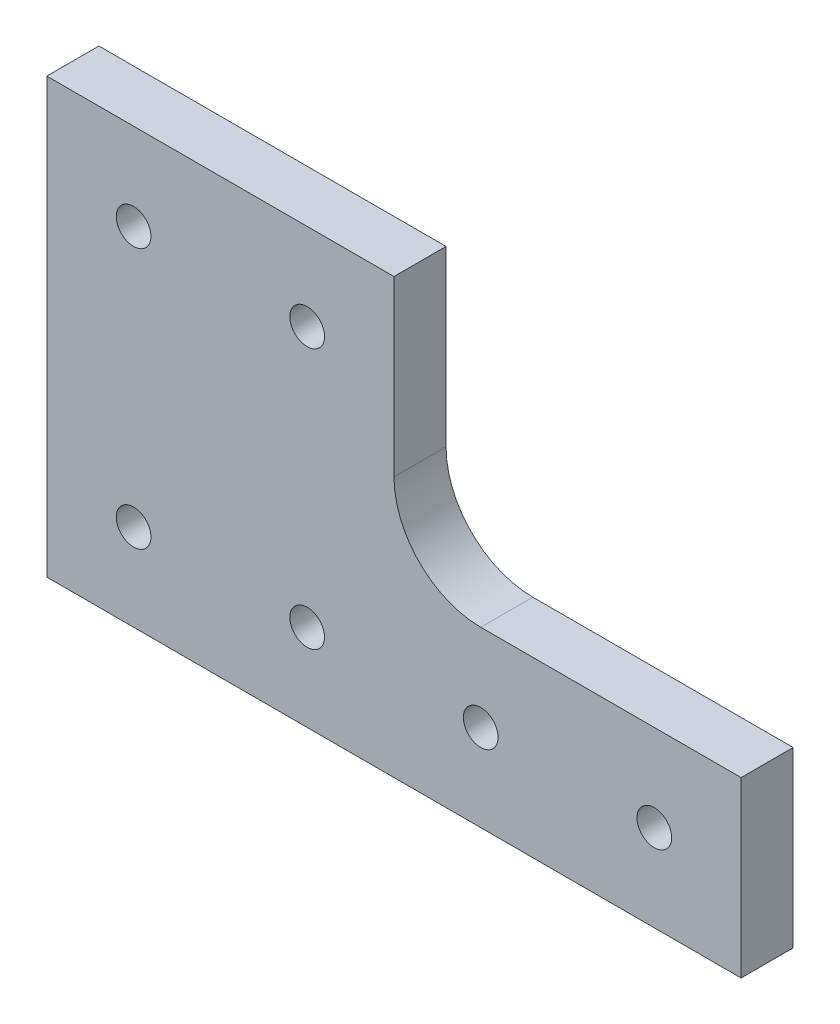
ISO-10303-21;
HEADER;
FILE_DESCRIPTION(('STEP AP214'),'2;1');
FILE_NAME('part.step','',(''),(''),'','','');
FILE_SCHEMA(('AUTOMOTIVE_DESIGN { 1 0 10303 214 1 1 1 1 }'));
ENDSEC;
DATA;
#1=APPLICATION_CONTEXT('core data for automotive mechanical design processes');
#2=APPLICATION_PROTOCOL_DEFINITION('international standard','automotive_design',2000,#1);
#3=PRODUCT_CONTEXT('',#1,'mechanical');
#4=PRODUCT('Part','Part','',(#3));
#5=PRODUCT_RELATED_PRODUCT_CATEGORY('part','',(#4));
#6=PRODUCT_DEFINITION_FORMATION('','',#4);
#7=PRODUCT_DEFINITION_CONTEXT('part definition',#1,'design');
#8=PRODUCT_DEFINITION('design','',#6,#7);
#9=PRODUCT_DEFINITION_SHAPE('','',#8);
#10=(LENGTH_UNIT() NAMED_UNIT(*) SI_UNIT(.MILLI.,.METRE.));
#11=(NAMED_UNIT(*) PLANE_ANGLE_UNIT() SI_UNIT($,.RADIAN.));
#12=(NAMED_UNIT(*) SI_UNIT($,.STERADIAN.) SOLID_ANGLE_UNIT());
#13=UNCERTAINTY_MEASURE_WITH_UNIT(LENGTH_MEASURE(1.E-05),#10,'distance_accuracy_value','');
#14=(GEOMETRIC_REPRESENTATION_CONTEXT(3) GLOBAL_UNCERTAINTY_ASSIGNED_CONTEXT((#13)) GLOBAL_UNIT_ASSIGNED_CONTEXT((#10,
#11,#12)) REPRESENTATION_CONTEXT('',''));
#15=CARTESIAN_POINT('',(0.,0.,0.));
#16=DIRECTION('',(0.,0.,1.));
#17=DIRECTION('',(1.,0.,0.));
#18=AXIS2_PLACEMENT_3D('',#15,#16,#17);
#19=CARTESIAN_POINT('',(0.,0.,6.));
#20=DIRECTION('',(0.,1.,0.));
#21=DIRECTION('',(0.,0.,1.));
#22=AXIS2_PLACEMENT_3D('',#19,#20,#21);
#23=PLANE('',#22);
#24=DIRECTION('',(1.,0.,0.));
#25=VECTOR('',#24,1.);
#26=CARTESIAN_POINT('',(0.,0.,0.));
#27=LINE('',#26,#25);
#28=CARTESIAN_POINT('',(0.,0.,0.));
#29=VERTEX_POINT('',#28);
#30=CARTESIAN_POINT('',(80.,0.,0.));
#31=VERTEX_POINT('',#30);
#32=EDGE_CURVE('E117',#29,#31,#27,.T.);
#33=ORIENTED_EDGE('',*,*,#32,.T.);
#34=DIRECTION('',(0.,0.,-1.));
#35=VECTOR('',#34,1.);
#36=CARTESIAN_POINT('',(80.,0.,6.));
#37=LINE('',#36,#35);
#38=CARTESIAN_POINT('',(80.,0.,6.));
#39=VERTEX_POINT('',#38);
#40=EDGE_CURVE('E98',#39,#31,#37,.T.);
#41=ORIENTED_EDGE('',*,*,#40,.F.);
#42=DIRECTION('',(1.,0.,0.));
#43=VECTOR('',#42,1.);
#44=CARTESIAN_POINT('',(0.,0.,6.));
#45=LINE('',#44,#43);
#46=CARTESIAN_POINT('',(0.,0.,6.));
#47=VERTEX_POINT('',#46);
#48=EDGE_CURVE('E104',#47,#39,#45,.T.);
#49=ORIENTED_EDGE('',*,*,#48,.F.);
#50=DIRECTION('',(0.,0.,-1.));
#51=VECTOR('',#50,1.);
#52=CARTESIAN_POINT('',(0.,0.,6.));
#53=LINE('',#52,#51);
#54=EDGE_CURVE('E130',#47,#29,#53,.T.);
#55=ORIENTED_EDGE('',*,*,#54,.T.);
#56=EDGE_LOOP('',(#33,#41,#49,#55));
#57=FACE_BOUND('',#56,.T.);
#58=ADVANCED_FACE('F35',(#57),#23,.F.);
#59=CARTESIAN_POINT('',(80.,0.,6.));
#60=DIRECTION('',(-1.,0.,0.));
#61=DIRECTION('',(0.,0.,1.));
#62=AXIS2_PLACEMENT_3D('',#59,#60,#61);
#63=PLANE('',#62);
#64=DIRECTION('',(0.,1.,0.));
#65=VECTOR('',#64,1.);
#66=CARTESIAN_POINT('',(80.,0.,0.));
#67=LINE('',#66,#65);
#68=CARTESIAN_POINT('',(80.,20.,0.));
#69=VERTEX_POINT('',#68);
#70=EDGE_CURVE('E150',#31,#69,#67,.T.);
#71=ORIENTED_EDGE('',*,*,#70,.T.);
#72=DIRECTION('',(0.,0.,-1.));
#73=VECTOR('',#72,1.);
#74=CARTESIAN_POINT('',(80.,20.,6.));
#75=LINE('',#74,#73);
#76=CARTESIAN_POINT('',(80.,20.,6.));
#77=VERTEX_POINT('',#76);
#78=EDGE_CURVE('E101',#77,#69,#75,.T.);
#79=ORIENTED_EDGE('',*,*,#78,.F.);
#80=DIRECTION('',(0.,1.,0.));
#81=VECTOR('',#80,1.);
#82=CARTESIAN_POINT('',(80.,0.,6.));
#83=LINE('',#82,#81);
#84=EDGE_CURVE('E93',#39,#77,#83,.T.);
#85=ORIENTED_EDGE('',*,*,#84,.F.);
#86=ORIENTED_EDGE('',*,*,#40,.T.);
#87=EDGE_LOOP('',(#71,#79,#85,#86));
#88=FACE_BOUND('',#87,.T.);
#89=ADVANCED_FACE('F96',(#88),#63,.F.);
#90=CARTESIAN_POINT('',(0.,20.,6.));
#91=DIRECTION('',(0.,1.,0.));
#92=DIRECTION('',(0.,0.,1.));
#93=AXIS2_PLACEMENT_3D('',#90,#91,#92);
#94=PLANE('',#93);
#95=DIRECTION('',(1.,0.,0.));
#96=VECTOR('',#95,1.);
#97=CARTESIAN_POINT('',(0.,20.,0.));
#98=LINE('',#97,#96);
#99=CARTESIAN_POINT('',(50.,20.,0.));
#100=VERTEX_POINT('',#99);
#101=EDGE_CURVE('E148',#100,#69,#98,.T.);
#102=ORIENTED_EDGE('',*,*,#101,.F.);
#103=DIRECTION('',(0.,0.,-1.));
#104=VECTOR('',#103,1.);
#105=CARTESIAN_POINT('',(50.,20.,6.));
#106=LINE('',#105,#104);
#107=CARTESIAN_POINT('',(50.,20.,6.));
#108=VERTEX_POINT('',#107);
#109=EDGE_CURVE('E50',#100,#108,#106,.F.);
#110=ORIENTED_EDGE('',*,*,#109,.T.);
#111=DIRECTION('',(1.,0.,0.));
#112=VECTOR('',#111,1.);
#113=CARTESIAN_POINT('',(0.,20.,6.));
#114=LINE('',#113,#112);
#115=EDGE_CURVE('E103',#108,#77,#114,.T.);
#116=ORIENTED_EDGE('',*,*,#115,.T.);
#117=ORIENTED_EDGE('',*,*,#78,.T.);
#118=EDGE_LOOP('',(#102,#110,#116,#117));
#119=FACE_BOUND('',#118,.T.);
#120=ADVANCED_FACE('F232',(#119),#94,.T.);
#121=CARTESIAN_POINT('',(40.,0.,6.));
#122=DIRECTION('',(-1.,0.,0.));
#123=DIRECTION('',(0.,-1.,0.));
#124=AXIS2_PLACEMENT_3D('',#121,#122,#123);
#125=PLANE('',#124);
#126=DIRECTION('',(0.,1.,0.));
#127=VECTOR('',#126,1.);
#128=CARTESIAN_POINT('',(40.,0.,6.));
#129=LINE('',#128,#127);
#130=CARTESIAN_POINT('',(40.,30.,6.));
#131=VERTEX_POINT('',#130);
#132=CARTESIAN_POINT('',(40.,50.,6.));
#133=VERTEX_POINT('',#132);
#134=EDGE_CURVE('E174',#131,#133,#129,.T.);
#135=ORIENTED_EDGE('',*,*,#134,.F.);
#136=DIRECTION('',(0.,0.,-1.));
#137=VECTOR('',#136,1.);
#138=CARTESIAN_POINT('',(40.,30.,6.));
#139=LINE('',#138,#137);
#140=CARTESIAN_POINT('',(40.,30.,0.));
#141=VERTEX_POINT('',#140);
#142=EDGE_CURVE('E118',#131,#141,#139,.T.);
#143=ORIENTED_EDGE('',*,*,#142,.T.);
#144=DIRECTION('',(0.,1.,0.));
#145=VECTOR('',#144,1.);
#146=CARTESIAN_POINT('',(40.,0.,0.));
#147=LINE('',#146,#145);
#148=CARTESIAN_POINT('',(40.,50.,0.));
#149=VERTEX_POINT('',#148);
#150=EDGE_CURVE('E146',#141,#149,#147,.T.);
#151=ORIENTED_EDGE('',*,*,#150,.T.);
#152=DIRECTION('',(0.,0.,-1.));
#153=VECTOR('',#152,1.);
#154=CARTESIAN_POINT('',(40.,50.,6.));
#155=LINE('',#154,#153);
#156=EDGE_CURVE('E122',#133,#149,#155,.T.);
#157=ORIENTED_EDGE('',*,*,#156,.F.);
#158=EDGE_LOOP('',(#135,#143,#151,#157));
#159=FACE_BOUND('',#158,.T.);
#160=ADVANCED_FACE('F269',(#159),#125,.F.);
#161=CARTESIAN_POINT('',(0.,50.,6.));
#162=DIRECTION('',(0.,1.,0.));
#163=DIRECTION('',(0.,0.,1.));
#164=AXIS2_PLACEMENT_3D('',#161,#162,#163);
#165=PLANE('',#164);
#166=DIRECTION('',(1.,0.,0.));
#167=VECTOR('',#166,1.);
#168=CARTESIAN_POINT('',(0.,50.,0.));
#169=LINE('',#168,#167);
#170=CARTESIAN_POINT('',(0.,50.,0.));
#171=VERTEX_POINT('',#170);
#172=EDGE_CURVE('E143',#171,#149,#169,.T.);
#173=ORIENTED_EDGE('',*,*,#172,.F.);
#174=DIRECTION('',(0.,0.,-1.));
#175=VECTOR('',#174,1.);
#176=CARTESIAN_POINT('',(0.,50.,6.));
#177=LINE('',#176,#175);
#178=CARTESIAN_POINT('',(0.,50.,6.));
#179=VERTEX_POINT('',#178);
#180=EDGE_CURVE('E128',#179,#171,#177,.T.);
#181=ORIENTED_EDGE('',*,*,#180,.F.);
#182=DIRECTION('',(1.,0.,0.));
#183=VECTOR('',#182,1.);
#184=CARTESIAN_POINT('',(0.,50.,6.));
#185=LINE('',#184,#183);
#186=EDGE_CURVE('E171',#179,#133,#185,.T.);
#187=ORIENTED_EDGE('',*,*,#186,.T.);
#188=ORIENTED_EDGE('',*,*,#156,.T.);
#189=EDGE_LOOP('',(#173,#181,#187,#188));
#190=FACE_BOUND('',#189,.T.);
#191=ADVANCED_FACE('F279',(#190),#165,.T.);
#192=CARTESIAN_POINT('',(70.,10.,6.));
#193=DIRECTION('',(0.,0.,-1.));
#194=DIRECTION('',(-1.,0.,0.));
#195=AXIS2_PLACEMENT_3D('',#192,#193,#194);
#196=CYLINDRICAL_SURFACE('',#195,2.);
#197=CARTESIAN_POINT('',(70.,10.,6.));
#198=DIRECTION('',(0.,0.,1.));
#199=DIRECTION('',(1.,0.,0.));
#200=AXIS2_PLACEMENT_3D('',#197,#198,#199);
#201=CIRCLE('',#200,2.);
#202=CARTESIAN_POINT('',(72.,10.,6.));
#203=VERTEX_POINT('',#202);
#204=EDGE_CURVE('E167',#203,#203,#201,.T.);
#205=ORIENTED_EDGE('',*,*,#204,.T.);
#206=EDGE_LOOP('',(#205));
#207=FACE_BOUND('',#206,.T.);
#208=CARTESIAN_POINT('',(70.,10.,0.));
#209=DIRECTION('',(0.,0.,1.));
#210=DIRECTION('',(1.,0.,0.));
#211=AXIS2_PLACEMENT_3D('',#208,#209,#210);
#212=CIRCLE('',#211,2.);
#213=CARTESIAN_POINT('',(72.,10.,0.));
#214=VERTEX_POINT('',#213);
#215=EDGE_CURVE('E137',#214,#214,#212,.T.);
#216=ORIENTED_EDGE('',*,*,#215,.F.);
#217=EDGE_LOOP('',(#216));
#218=FACE_BOUND('',#217,.T.);
#219=ADVANCED_FACE('F315',(#207,#218),#196,.F.);
#220=CARTESIAN_POINT('',(0.,0.,6.));
#221=DIRECTION('',(-1.,0.,0.));
#222=DIRECTION('',(0.,-1.,0.));
#223=AXIS2_PLACEMENT_3D('',#220,#221,#222);
#224=PLANE('',#223);
#225=DIRECTION('',(0.,1.,0.));
#226=VECTOR('',#225,1.);
#227=CARTESIAN_POINT('',(0.,0.,0.));
#228=LINE('',#227,#226);
#229=EDGE_CURVE('E140',#29,#171,#228,.T.);
#230=ORIENTED_EDGE('',*,*,#229,.F.);
#231=ORIENTED_EDGE('',*,*,#54,.F.);
#232=DIRECTION('',(0.,1.,0.));
#233=VECTOR('',#232,1.);
#234=CARTESIAN_POINT('',(0.,0.,6.));
#235=LINE('',#234,#233);
#236=EDGE_CURVE('E112',#47,#179,#235,.T.);
#237=ORIENTED_EDGE('',*,*,#236,.T.);
#238=ORIENTED_EDGE('',*,*,#180,.T.);
#239=EDGE_LOOP('',(#230,#231,#237,#238));
#240=FACE_BOUND('',#239,.T.);
#241=ADVANCED_FACE('F206',(#240),#224,.T.);
#242=CARTESIAN_POINT('',(10.,40.,6.));
#243=DIRECTION('',(0.,0.,-1.));
#244=DIRECTION('',(-1.,0.,0.));
#245=AXIS2_PLACEMENT_3D('',#242,#243,#244);
#246=CYLINDRICAL_SURFACE('',#245,2.);
#247=CARTESIAN_POINT('',(10.,40.,6.));
#248=DIRECTION('',(0.,0.,1.));
#249=DIRECTION('',(1.,0.,0.));
#250=AXIS2_PLACEMENT_3D('',#247,#248,#249);
#251=CIRCLE('',#250,2.);
#252=CARTESIAN_POINT('',(12.,40.,6.));
#253=VERTEX_POINT('',#252);
#254=EDGE_CURVE('E114',#253,#253,#251,.T.);
#255=ORIENTED_EDGE('',*,*,#254,.T.);
#256=EDGE_LOOP('',(#255));
#257=FACE_BOUND('',#256,.T.);
#258=CARTESIAN_POINT('',(10.,40.,0.));
#259=DIRECTION('',(0.,0.,1.));
#260=DIRECTION('',(1.,0.,0.));
#261=AXIS2_PLACEMENT_3D('',#258,#259,#260);
#262=CIRCLE('',#261,2.);
#263=CARTESIAN_POINT('',(12.,40.,0.));
#264=VERTEX_POINT('',#263);
#265=EDGE_CURVE('E153',#264,#264,#262,.T.);
#266=ORIENTED_EDGE('',*,*,#265,.F.);
#267=EDGE_LOOP('',(#266));
#268=FACE_BOUND('',#267,.T.);
#269=ADVANCED_FACE('F202',(#257,#268),#246,.F.);
#270=CARTESIAN_POINT('',(30.,40.,6.));
#271=DIRECTION('',(0.,0.,-1.));
#272=DIRECTION('',(-1.,0.,0.));
#273=AXIS2_PLACEMENT_3D('',#270,#271,#272);
#274=CYLINDRICAL_SURFACE('',#273,2.);
#275=CARTESIAN_POINT('',(30.,40.,6.));
#276=DIRECTION('',(0.,0.,1.));
#277=DIRECTION('',(1.,0.,0.));
#278=AXIS2_PLACEMENT_3D('',#275,#276,#277);
#279=CIRCLE('',#278,2.);
#280=CARTESIAN_POINT('',(32.,40.,6.));
#281=VERTEX_POINT('',#280);
#282=EDGE_CURVE('E179',#281,#281,#279,.T.);
#283=ORIENTED_EDGE('',*,*,#282,.T.);
#284=EDGE_LOOP('',(#283));
#285=FACE_BOUND('',#284,.T.);
#286=CARTESIAN_POINT('',(30.,40.,0.));
#287=DIRECTION('',(0.,0.,1.));
#288=DIRECTION('',(1.,0.,0.));
#289=AXIS2_PLACEMENT_3D('',#286,#287,#288);
#290=CIRCLE('',#289,2.);
#291=CARTESIAN_POINT('',(32.,40.,0.));
#292=VERTEX_POINT('',#291);
#293=EDGE_CURVE('E156',#292,#292,#290,.T.);
#294=ORIENTED_EDGE('',*,*,#293,.F.);
#295=EDGE_LOOP('',(#294));
#296=FACE_BOUND('',#295,.T.);
#297=ADVANCED_FACE('F205',(#285,#296),#274,.F.);
#298=CARTESIAN_POINT('',(10.,10.,6.));
#299=DIRECTION('',(0.,0.,-1.));
#300=DIRECTION('',(-1.,0.,0.));
#301=AXIS2_PLACEMENT_3D('',#298,#299,#300);
#302=CYLINDRICAL_SURFACE('',#301,2.);
#303=CARTESIAN_POINT('',(10.,10.,6.));
#304=DIRECTION('',(0.,0.,1.));
#305=DIRECTION('',(1.,0.,0.));
#306=AXIS2_PLACEMENT_3D('',#303,#304,#305);
#307=CIRCLE('',#306,2.);
#308=CARTESIAN_POINT('',(12.,10.,6.));
#309=VERTEX_POINT('',#308);
#310=EDGE_CURVE('E182',#309,#309,#307,.T.);
#311=ORIENTED_EDGE('',*,*,#310,.T.);
#312=EDGE_LOOP('',(#311));
#313=FACE_BOUND('',#312,.T.);
#314=CARTESIAN_POINT('',(10.,10.,0.));
#315=DIRECTION('',(0.,0.,1.));
#316=DIRECTION('',(1.,0.,0.));
#317=AXIS2_PLACEMENT_3D('',#314,#315,#316);
#318=CIRCLE('',#317,2.);
#319=CARTESIAN_POINT('',(12.,10.,0.));
#320=VERTEX_POINT('',#319);
#321=EDGE_CURVE('E159',#320,#320,#318,.T.);
#322=ORIENTED_EDGE('',*,*,#321,.F.);
#323=EDGE_LOOP('',(#322));
#324=FACE_BOUND('',#323,.T.);
#325=ADVANCED_FACE('F225',(#313,#324),#302,.F.);
#326=CARTESIAN_POINT('',(30.,10.,6.));
#327=DIRECTION('',(0.,0.,-1.));
#328=DIRECTION('',(-1.,0.,0.));
#329=AXIS2_PLACEMENT_3D('',#326,#327,#328);
#330=CYLINDRICAL_SURFACE('',#329,2.);
#331=CARTESIAN_POINT('',(30.,10.,6.));
#332=DIRECTION('',(0.,0.,1.));
#333=DIRECTION('',(1.,0.,0.));
#334=AXIS2_PLACEMENT_3D('',#331,#332,#333);
#335=CIRCLE('',#334,2.);
#336=CARTESIAN_POINT('',(32.,10.,6.));
#337=VERTEX_POINT('',#336);
#338=EDGE_CURVE('E136',#337,#337,#335,.T.);
#339=ORIENTED_EDGE('',*,*,#338,.T.);
#340=EDGE_LOOP('',(#339));
#341=FACE_BOUND('',#340,.T.);
#342=CARTESIAN_POINT('',(30.,10.,0.));
#343=DIRECTION('',(0.,0.,1.));
#344=DIRECTION('',(1.,0.,0.));
#345=AXIS2_PLACEMENT_3D('',#342,#343,#344);
#346=CIRCLE('',#345,2.);
#347=CARTESIAN_POINT('',(32.,10.,0.));
#348=VERTEX_POINT('',#347);
#349=EDGE_CURVE('E162',#348,#348,#346,.T.);
#350=ORIENTED_EDGE('',*,*,#349,.F.);
#351=EDGE_LOOP('',(#350));
#352=FACE_BOUND('',#351,.T.);
#353=ADVANCED_FACE('F188',(#341,#352),#330,.F.);
#354=CARTESIAN_POINT('',(50.,10.,6.));
#355=DIRECTION('',(0.,0.,-1.));
#356=DIRECTION('',(-1.,0.,0.));
#357=AXIS2_PLACEMENT_3D('',#354,#355,#356);
#358=CYLINDRICAL_SURFACE('',#357,2.);
#359=CARTESIAN_POINT('',(50.,10.,6.));
#360=DIRECTION('',(0.,0.,1.));
#361=DIRECTION('',(1.,0.,0.));
#362=AXIS2_PLACEMENT_3D('',#359,#360,#361);
#363=CIRCLE('',#362,2.);
#364=CARTESIAN_POINT('',(52.,10.,6.));
#365=VERTEX_POINT('',#364);
#366=EDGE_CURVE('E132',#365,#365,#363,.T.);
#367=ORIENTED_EDGE('',*,*,#366,.T.);
#368=EDGE_LOOP('',(#367));
#369=FACE_BOUND('',#368,.T.);
#370=CARTESIAN_POINT('',(50.,10.,0.));
#371=DIRECTION('',(0.,0.,1.));
#372=DIRECTION('',(1.,0.,0.));
#373=AXIS2_PLACEMENT_3D('',#370,#371,#372);
#374=CIRCLE('',#373,2.);
#375=CARTESIAN_POINT('',(52.,10.,0.));
#376=VERTEX_POINT('',#375);
#377=EDGE_CURVE('E133',#376,#376,#374,.T.);
#378=ORIENTED_EDGE('',*,*,#377,.F.);
#379=EDGE_LOOP('',(#378));
#380=FACE_BOUND('',#379,.T.);
#381=ADVANCED_FACE('F194',(#369,#380),#358,.F.);
#382=CARTESIAN_POINT('',(0.,0.,6.));
#383=DIRECTION('',(0.,0.,1.));
#384=DIRECTION('',(1.,0.,0.));
#385=AXIS2_PLACEMENT_3D('',#382,#383,#384);
#386=PLANE('',#385);
#387=ORIENTED_EDGE('',*,*,#338,.F.);
#388=EDGE_LOOP('',(#387));
#389=FACE_BOUND('',#388,.T.);
#390=ORIENTED_EDGE('',*,*,#310,.F.);
#391=EDGE_LOOP('',(#390));
#392=FACE_BOUND('',#391,.T.);
#393=ORIENTED_EDGE('',*,*,#282,.F.);
#394=EDGE_LOOP('',(#393));
#395=FACE_BOUND('',#394,.T.);
#396=ORIENTED_EDGE('',*,*,#254,.F.);
#397=EDGE_LOOP('',(#396));
#398=FACE_BOUND('',#397,.T.);
#399=ORIENTED_EDGE('',*,*,#48,.T.);
#400=ORIENTED_EDGE('',*,*,#84,.T.);
#401=ORIENTED_EDGE('',*,*,#115,.F.);
#402=CARTESIAN_POINT('',(50.,30.,6.));
#403=DIRECTION('',(0.,0.,1.));
#404=DIRECTION('',(1.,0.,0.));
#405=AXIS2_PLACEMENT_3D('',#402,#403,#404);
#406=CIRCLE('',#405,10.);
#407=EDGE_CURVE('E11',#108,#131,#406,.F.);
#408=ORIENTED_EDGE('',*,*,#407,.T.);
#409=ORIENTED_EDGE('',*,*,#134,.T.);
#410=ORIENTED_EDGE('',*,*,#186,.F.);
#411=ORIENTED_EDGE('',*,*,#236,.F.);
#412=EDGE_LOOP('',(#399,#400,#401,#408,#409,#410,#411));
#413=FACE_BOUND('',#412,.T.);
#414=ORIENTED_EDGE('',*,*,#204,.F.);
#415=EDGE_LOOP('',(#414));
#416=FACE_BOUND('',#415,.T.);
#417=ORIENTED_EDGE('',*,*,#366,.F.);
#418=EDGE_LOOP('',(#417));
#419=FACE_BOUND('',#418,.T.);
#420=ADVANCED_FACE('F108',(#389,#392,#395,#398,#413,#416,#419),#386,.T.);
#421=CARTESIAN_POINT('',(0.,0.,0.));
#422=DIRECTION('',(0.,0.,1.));
#423=DIRECTION('',(1.,0.,0.));
#424=AXIS2_PLACEMENT_3D('',#421,#422,#423);
#425=PLANE('',#424);
#426=ORIENTED_EDGE('',*,*,#349,.T.);
#427=EDGE_LOOP('',(#426));
#428=FACE_BOUND('',#427,.T.);
#429=ORIENTED_EDGE('',*,*,#321,.T.);
#430=EDGE_LOOP('',(#429));
#431=FACE_BOUND('',#430,.T.);
#432=ORIENTED_EDGE('',*,*,#293,.T.);
#433=EDGE_LOOP('',(#432));
#434=FACE_BOUND('',#433,.T.);
#435=ORIENTED_EDGE('',*,*,#265,.T.);
#436=EDGE_LOOP('',(#435));
#437=FACE_BOUND('',#436,.T.);
#438=ORIENTED_EDGE('',*,*,#32,.F.);
#439=ORIENTED_EDGE('',*,*,#229,.T.);
#440=ORIENTED_EDGE('',*,*,#172,.T.);
#441=ORIENTED_EDGE('',*,*,#150,.F.);
#442=CARTESIAN_POINT('',(50.,30.,0.));
#443=DIRECTION('',(0.,0.,1.));
#444=DIRECTION('',(1.,0.,0.));
#445=AXIS2_PLACEMENT_3D('',#442,#443,#444);
#446=CIRCLE('',#445,10.);
#447=EDGE_CURVE('E43',#141,#100,#446,.T.);
#448=ORIENTED_EDGE('',*,*,#447,.T.);
#449=ORIENTED_EDGE('',*,*,#101,.T.);
#450=ORIENTED_EDGE('',*,*,#70,.F.);
#451=EDGE_LOOP('',(#438,#439,#440,#441,#448,#449,#450));
#452=FACE_BOUND('',#451,.T.);
#453=ORIENTED_EDGE('',*,*,#215,.T.);
#454=EDGE_LOOP('',(#453));
#455=FACE_BOUND('',#454,.T.);
#456=ORIENTED_EDGE('',*,*,#377,.T.);
#457=EDGE_LOOP('',(#456));
#458=FACE_BOUND('',#457,.T.);
#459=ADVANCED_FACE('F193',(#428,#431,#434,#437,#452,#455,#458),#425,.F.);
#460=CARTESIAN_POINT('',(50.,30.,6.));
#461=DIRECTION('',(0.,0.,-1.));
#462=DIRECTION('',(-1.,0.,0.));
#463=AXIS2_PLACEMENT_3D('',#460,#461,#462);
#464=CYLINDRICAL_SURFACE('',#463,10.);
#465=ORIENTED_EDGE('',*,*,#407,.F.);
#466=ORIENTED_EDGE('',*,*,#109,.F.);
#467=ORIENTED_EDGE('',*,*,#447,.F.);
#468=ORIENTED_EDGE('',*,*,#142,.F.);
#469=EDGE_LOOP('',(#465,#466,#467,#468));
#470=FACE_BOUND('',#469,.T.);
#471=ADVANCED_FACE('F37',(#470),#464,.F.);
#472=CLOSED_SHELL('',(#58,#89,#120,#160,#191,#219,#241,#269,#297,#325,#353,#381,#420,#459,#471));
#473=MANIFOLD_SOLID_BREP('B2',#472);
#474=ADVANCED_BREP_SHAPE_REPRESENTATION('',(#18,#473),#14);
#475=SHAPE_DEFINITION_REPRESENTATION(#9,#474);
ENDSEC;
END-ISO-10303-21;
